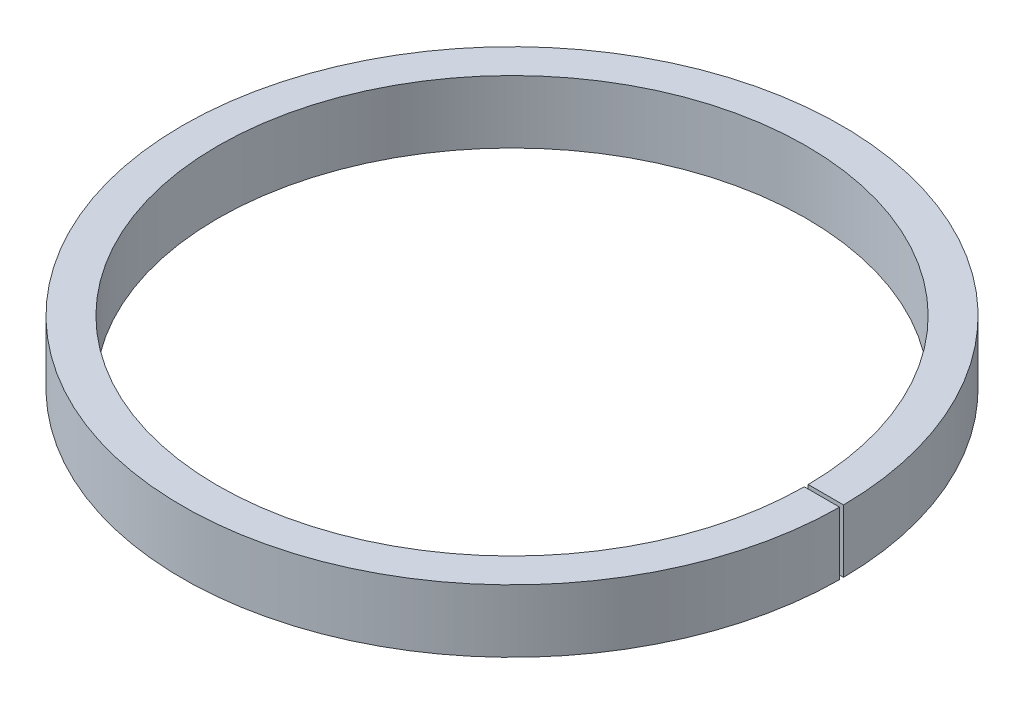
ISO-10303-21;
HEADER;
FILE_DESCRIPTION(('STEP AP214'),'2;1');
FILE_NAME('part.step','',(''),(''),'','','');
FILE_SCHEMA(('AUTOMOTIVE_DESIGN { 1 0 10303 214 1 1 1 1 }'));
ENDSEC;
DATA;
#1=APPLICATION_CONTEXT('core data for automotive mechanical design processes');
#2=APPLICATION_PROTOCOL_DEFINITION('international standard','automotive_design',2000,#1);
#3=PRODUCT_CONTEXT('',#1,'mechanical');
#4=PRODUCT('Part','Part','',(#3));
#5=PRODUCT_RELATED_PRODUCT_CATEGORY('part','',(#4));
#6=PRODUCT_DEFINITION_FORMATION('','',#4);
#7=PRODUCT_DEFINITION_CONTEXT('part definition',#1,'design');
#8=PRODUCT_DEFINITION('design','',#6,#7);
#9=PRODUCT_DEFINITION_SHAPE('','',#8);
#10=(LENGTH_UNIT() NAMED_UNIT(*) SI_UNIT(.MILLI.,.METRE.));
#11=(NAMED_UNIT(*) PLANE_ANGLE_UNIT() SI_UNIT($,.RADIAN.));
#12=(NAMED_UNIT(*) SI_UNIT($,.STERADIAN.) SOLID_ANGLE_UNIT());
#13=UNCERTAINTY_MEASURE_WITH_UNIT(LENGTH_MEASURE(1.E-05),#10,'distance_accuracy_value','');
#14=(GEOMETRIC_REPRESENTATION_CONTEXT(3) GLOBAL_UNCERTAINTY_ASSIGNED_CONTEXT((#13)) GLOBAL_UNIT_ASSIGNED_CONTEXT((#10,
#11,#12)) REPRESENTATION_CONTEXT('',''));
#15=CARTESIAN_POINT('',(0.,0.,0.));
#16=DIRECTION('',(0.,0.,1.));
#17=DIRECTION('',(1.,0.,0.));
#18=AXIS2_PLACEMENT_3D('',#15,#16,#17);
#19=CARTESIAN_POINT('',(0.,4.,0.));
#20=DIRECTION('',(0.,-1.,0.));
#21=DIRECTION('',(0.,0.,-1.));
#22=AXIS2_PLACEMENT_3D('',#19,#20,#21);
#23=CYLINDRICAL_SURFACE('',#22,37.5);
#24=CARTESIAN_POINT('',(0.,-4.,0.));
#25=DIRECTION('',(0.,-1.,0.));
#26=DIRECTION('',(0.,0.,1.));
#27=AXIS2_PLACEMENT_3D('',#24,#25,#26);
#28=CIRCLE('',#27,37.5);
#29=CARTESIAN_POINT('',(37.4991666574072,-4.,0.25));
#30=VERTEX_POINT('',#29);
#31=CARTESIAN_POINT('',(37.4991666574072,-4.,-0.25));
#32=VERTEX_POINT('',#31);
#33=EDGE_CURVE('E97',#30,#32,#28,.T.);
#34=ORIENTED_EDGE('',*,*,#33,.T.);
#35=DIRECTION('',(0.,-1.,0.));
#36=VECTOR('',#35,1.);
#37=CARTESIAN_POINT('',(37.4991666574072,4.,-0.25));
#38=LINE('',#37,#36);
#39=CARTESIAN_POINT('',(37.4991666574072,4.,-0.25));
#40=VERTEX_POINT('',#39);
#41=EDGE_CURVE('E11',#40,#32,#38,.T.);
#42=ORIENTED_EDGE('',*,*,#41,.F.);
#43=CARTESIAN_POINT('',(0.,4.,0.));
#44=DIRECTION('',(0.,-1.,0.));
#45=DIRECTION('',(0.,0.,1.));
#46=AXIS2_PLACEMENT_3D('',#43,#44,#45);
#47=CIRCLE('',#46,37.5);
#48=CARTESIAN_POINT('',(37.4991666574072,4.,0.25));
#49=VERTEX_POINT('',#48);
#50=EDGE_CURVE('E85',#49,#40,#47,.T.);
#51=ORIENTED_EDGE('',*,*,#50,.F.);
#52=DIRECTION('',(0.,-1.,0.));
#53=VECTOR('',#52,1.);
#54=CARTESIAN_POINT('',(37.4991666574072,4.,0.25));
#55=LINE('',#54,#53);
#56=EDGE_CURVE('E93',#49,#30,#55,.T.);
#57=ORIENTED_EDGE('',*,*,#56,.T.);
#58=EDGE_LOOP('',(#34,#42,#51,#57));
#59=FACE_BOUND('',#58,.T.);
#60=ADVANCED_FACE('F34',(#59),#23,.F.);
#61=CARTESIAN_POINT('',(37.4991666574072,4.,-0.25));
#62=DIRECTION('',(0.,0.,-1.));
#63=DIRECTION('',(-1.,0.,0.));
#64=AXIS2_PLACEMENT_3D('',#61,#62,#63);
#65=PLANE('',#64);
#66=DIRECTION('',(1.,0.,0.));
#67=VECTOR('',#66,1.);
#68=CARTESIAN_POINT('',(37.4991666574072,-4.,-0.25));
#69=LINE('',#68,#67);
#70=CARTESIAN_POINT('',(41.9992559457903,-4.,-0.25));
#71=VERTEX_POINT('',#70);
#72=EDGE_CURVE('E89',#32,#71,#69,.T.);
#73=ORIENTED_EDGE('',*,*,#72,.T.);
#74=DIRECTION('',(0.,-1.,0.));
#75=VECTOR('',#74,1.);
#76=CARTESIAN_POINT('',(41.9992559457903,4.,-0.25));
#77=LINE('',#76,#75);
#78=CARTESIAN_POINT('',(41.9992559457903,4.,-0.25));
#79=VERTEX_POINT('',#78);
#80=EDGE_CURVE('E42',#79,#71,#77,.T.);
#81=ORIENTED_EDGE('',*,*,#80,.F.);
#82=DIRECTION('',(1.,0.,0.));
#83=VECTOR('',#82,1.);
#84=CARTESIAN_POINT('',(37.4991666574072,4.,-0.25));
#85=LINE('',#84,#83);
#86=EDGE_CURVE('E80',#40,#79,#85,.T.);
#87=ORIENTED_EDGE('',*,*,#86,.F.);
#88=ORIENTED_EDGE('',*,*,#41,.T.);
#89=EDGE_LOOP('',(#73,#81,#87,#88));
#90=FACE_BOUND('',#89,.T.);
#91=ADVANCED_FACE('F88',(#90),#65,.F.);
#92=CARTESIAN_POINT('',(0.,4.,0.));
#93=DIRECTION('',(0.,-1.,0.));
#94=DIRECTION('',(0.,0.,-1.));
#95=AXIS2_PLACEMENT_3D('',#92,#93,#94);
#96=CYLINDRICAL_SURFACE('',#95,42.);
#97=CARTESIAN_POINT('',(0.,-4.,0.));
#98=DIRECTION('',(0.,1.,0.));
#99=DIRECTION('',(0.,0.,1.));
#100=AXIS2_PLACEMENT_3D('',#97,#98,#99);
#101=CIRCLE('',#100,42.);
#102=CARTESIAN_POINT('',(41.9992559457903,-4.,0.250000000000002));
#103=VERTEX_POINT('',#102);
#104=EDGE_CURVE('E67',#71,#103,#101,.T.);
#105=ORIENTED_EDGE('',*,*,#104,.T.);
#106=DIRECTION('',(0.,-1.,0.));
#107=VECTOR('',#106,1.);
#108=CARTESIAN_POINT('',(41.9992559457903,4.,0.250000000000002));
#109=LINE('',#108,#107);
#110=CARTESIAN_POINT('',(41.9992559457903,4.,0.250000000000002));
#111=VERTEX_POINT('',#110);
#112=EDGE_CURVE('E90',#111,#103,#109,.T.);
#113=ORIENTED_EDGE('',*,*,#112,.F.);
#114=CARTESIAN_POINT('',(0.,4.,0.));
#115=DIRECTION('',(0.,1.,0.));
#116=DIRECTION('',(0.,0.,1.));
#117=AXIS2_PLACEMENT_3D('',#114,#115,#116);
#118=CIRCLE('',#117,42.);
#119=EDGE_CURVE('E83',#79,#111,#118,.T.);
#120=ORIENTED_EDGE('',*,*,#119,.F.);
#121=ORIENTED_EDGE('',*,*,#80,.T.);
#122=EDGE_LOOP('',(#105,#113,#120,#121));
#123=FACE_BOUND('',#122,.T.);
#124=ADVANCED_FACE('F91',(#123),#96,.T.);
#125=CARTESIAN_POINT('',(37.4991666574072,4.,0.25));
#126=DIRECTION('',(0.,0.,1.));
#127=DIRECTION('',(1.,0.,0.));
#128=AXIS2_PLACEMENT_3D('',#125,#126,#127);
#129=PLANE('',#128);
#130=DIRECTION('',(-1.,0.,0.));
#131=VECTOR('',#130,1.);
#132=CARTESIAN_POINT('',(37.4991666574072,-4.,0.25));
#133=LINE('',#132,#131);
#134=EDGE_CURVE('E73',#103,#30,#133,.T.);
#135=ORIENTED_EDGE('',*,*,#134,.T.);
#136=ORIENTED_EDGE('',*,*,#56,.F.);
#137=DIRECTION('',(-1.,0.,0.));
#138=VECTOR('',#137,1.);
#139=CARTESIAN_POINT('',(37.4991666574072,4.,0.25));
#140=LINE('',#139,#138);
#141=EDGE_CURVE('E50',#111,#49,#140,.T.);
#142=ORIENTED_EDGE('',*,*,#141,.F.);
#143=ORIENTED_EDGE('',*,*,#112,.T.);
#144=EDGE_LOOP('',(#135,#136,#142,#143));
#145=FACE_BOUND('',#144,.T.);
#146=ADVANCED_FACE('F104',(#145),#129,.F.);
#147=CARTESIAN_POINT('',(0.,4.,0.));
#148=DIRECTION('',(0.,1.,0.));
#149=DIRECTION('',(0.,0.,1.));
#150=AXIS2_PLACEMENT_3D('',#147,#148,#149);
#151=PLANE('',#150);
#152=ORIENTED_EDGE('',*,*,#50,.T.);
#153=ORIENTED_EDGE('',*,*,#86,.T.);
#154=ORIENTED_EDGE('',*,*,#119,.T.);
#155=ORIENTED_EDGE('',*,*,#141,.T.);
#156=EDGE_LOOP('',(#152,#153,#154,#155));
#157=FACE_BOUND('',#156,.T.);
#158=ADVANCED_FACE('F81',(#157),#151,.T.);
#159=CARTESIAN_POINT('',(0.,-4.,0.));
#160=DIRECTION('',(0.,1.,0.));
#161=DIRECTION('',(0.,0.,1.));
#162=AXIS2_PLACEMENT_3D('',#159,#160,#161);
#163=PLANE('',#162);
#164=ORIENTED_EDGE('',*,*,#33,.F.);
#165=ORIENTED_EDGE('',*,*,#134,.F.);
#166=ORIENTED_EDGE('',*,*,#104,.F.);
#167=ORIENTED_EDGE('',*,*,#72,.F.);
#168=EDGE_LOOP('',(#164,#165,#166,#167));
#169=FACE_BOUND('',#168,.T.);
#170=ADVANCED_FACE('F107',(#169),#163,.F.);
#171=CLOSED_SHELL('',(#60,#91,#124,#146,#158,#170));
#172=MANIFOLD_SOLID_BREP('B2',#171);
#173=ADVANCED_BREP_SHAPE_REPRESENTATION('',(#18,#172),#14);
#174=SHAPE_DEFINITION_REPRESENTATION(#9,#173);
ENDSEC;
END-ISO-10303-21;
